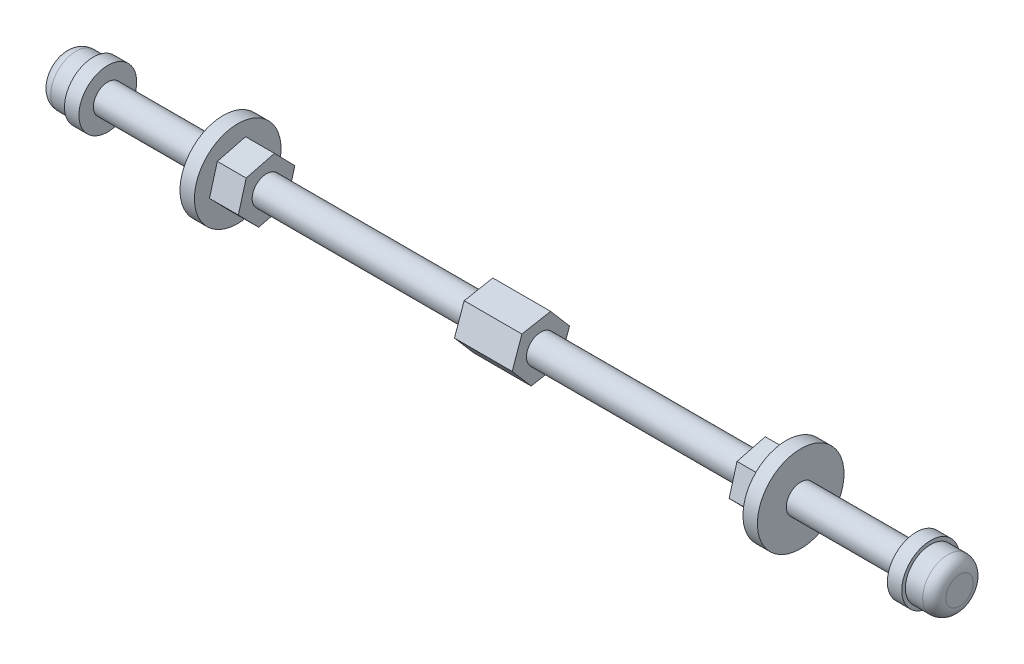
ISO-10303-21;
HEADER;
FILE_DESCRIPTION(('STEP AP214'),'2;1');
FILE_NAME('part.step','',(''),(''),'','','');
FILE_SCHEMA(('AUTOMOTIVE_DESIGN { 1 0 10303 214 1 1 1 1 }'));
ENDSEC;
DATA;
#1=APPLICATION_CONTEXT('core data for automotive mechanical design processes');
#2=APPLICATION_PROTOCOL_DEFINITION('international standard','automotive_design',2000,#1);
#3=PRODUCT_CONTEXT('',#1,'mechanical');
#4=PRODUCT('Part','Part','',(#3));
#5=PRODUCT_RELATED_PRODUCT_CATEGORY('part','',(#4));
#6=PRODUCT_DEFINITION_FORMATION('','',#4);
#7=PRODUCT_DEFINITION_CONTEXT('part definition',#1,'design');
#8=PRODUCT_DEFINITION('design','',#6,#7);
#9=PRODUCT_DEFINITION_SHAPE('','',#8);
#10=(LENGTH_UNIT() NAMED_UNIT(*) SI_UNIT(.MILLI.,.METRE.));
#11=(NAMED_UNIT(*) PLANE_ANGLE_UNIT() SI_UNIT($,.RADIAN.));
#12=(NAMED_UNIT(*) SI_UNIT($,.STERADIAN.) SOLID_ANGLE_UNIT());
#13=UNCERTAINTY_MEASURE_WITH_UNIT(LENGTH_MEASURE(1.E-05),#10,'distance_accuracy_value','');
#14=(GEOMETRIC_REPRESENTATION_CONTEXT(3) GLOBAL_UNCERTAINTY_ASSIGNED_CONTEXT((#13)) GLOBAL_UNIT_ASSIGNED_CONTEXT((#10,
#11,#12)) REPRESENTATION_CONTEXT('',''));
#15=CARTESIAN_POINT('',(0.,0.,0.));
#16=DIRECTION('',(0.,0.,1.));
#17=DIRECTION('',(1.,0.,0.));
#18=AXIS2_PLACEMENT_3D('',#15,#16,#17);
#19=CARTESIAN_POINT('',(-60.325,0.,0.));
#20=DIRECTION('',(1.,0.,0.));
#21=DIRECTION('',(0.,0.,-1.));
#22=AXIS2_PLACEMENT_3D('',#19,#20,#21);
#23=CYLINDRICAL_SURFACE('',#22,3.175);
#24=CARTESIAN_POINT('',(-6.35,0.,0.));
#25=DIRECTION('',(1.,0.,0.));
#26=DIRECTION('',(0.,0.,-1.));
#27=AXIS2_PLACEMENT_3D('',#24,#25,#26);
#28=CIRCLE('',#27,3.175);
#29=CARTESIAN_POINT('',(-6.35,0.,-3.175));
#30=VERTEX_POINT('',#29);
#31=EDGE_CURVE('E329',#30,#30,#28,.T.);
#32=ORIENTED_EDGE('',*,*,#31,.F.);
#33=EDGE_LOOP('',(#32));
#34=FACE_BOUND('',#33,.T.);
#35=CARTESIAN_POINT('',(-53.975,0.,0.));
#36=DIRECTION('',(-1.,0.,0.));
#37=DIRECTION('',(0.,0.,1.));
#38=AXIS2_PLACEMENT_3D('',#35,#36,#37);
#39=CIRCLE('',#38,3.175);
#40=CARTESIAN_POINT('',(-53.975,0.,3.175));
#41=VERTEX_POINT('',#40);
#42=EDGE_CURVE('E249',#41,#41,#39,.F.);
#43=ORIENTED_EDGE('',*,*,#42,.T.);
#44=EDGE_LOOP('',(#43));
#45=FACE_BOUND('',#44,.T.);
#46=ADVANCED_FACE('F41',(#34,#45),#23,.T.);
#47=CARTESIAN_POINT('',(-6.35,-6.0497679994844,2.13608502540229));
#48=DIRECTION('',(0.,-0.983087144735073,-0.183138378983327));
#49=DIRECTION('',(0.,0.183138378983327,-0.983087144735074));
#50=AXIS2_PLACEMENT_3D('',#47,#48,#49);
#51=PLANE('',#50);
#52=DIRECTION('',(1.,0.,0.));
#53=VECTOR('',#52,1.);
#54=CARTESIAN_POINT('',(-6.35,-4.87478789638411,-4.17121026185451));
#55=LINE('',#54,#53);
#56=CARTESIAN_POINT('',(-6.35,-4.87478789638411,-4.17121026185451));
#57=VERTEX_POINT('',#56);
#58=CARTESIAN_POINT('',(6.35,-4.87478789638411,-4.17121026185451));
#59=VERTEX_POINT('',#58);
#60=EDGE_CURVE('E378',#57,#59,#55,.T.);
#61=ORIENTED_EDGE('',*,*,#60,.T.);
#62=DIRECTION('',(0.,0.183138378983327,-0.983087144735073));
#63=VECTOR('',#62,1.);
#64=CARTESIAN_POINT('',(6.35,-6.0497679994844,2.13608502540229));
#65=LINE('',#64,#63);
#66=CARTESIAN_POINT('',(6.35,-6.0497679994844,2.13608502540229));
#67=VERTEX_POINT('',#66);
#68=EDGE_CURVE('E333',#67,#59,#65,.T.);
#69=ORIENTED_EDGE('',*,*,#68,.F.);
#70=DIRECTION('',(1.,0.,0.));
#71=VECTOR('',#70,1.);
#72=CARTESIAN_POINT('',(-6.35,-6.0497679994844,2.13608502540229));
#73=LINE('',#72,#71);
#74=CARTESIAN_POINT('',(-6.35,-6.0497679994844,2.13608502540229));
#75=VERTEX_POINT('',#74);
#76=EDGE_CURVE('E57',#75,#67,#73,.T.);
#77=ORIENTED_EDGE('',*,*,#76,.F.);
#78=DIRECTION('',(0.,0.183138378983327,-0.983087144735073));
#79=VECTOR('',#78,1.);
#80=CARTESIAN_POINT('',(-6.35,-6.0497679994844,2.13608502540229));
#81=LINE('',#80,#79);
#82=EDGE_CURVE('E357',#75,#57,#81,.T.);
#83=ORIENTED_EDGE('',*,*,#82,.T.);
#84=EDGE_LOOP('',(#61,#69,#77,#83));
#85=FACE_BOUND('',#84,.T.);
#86=ADVANCED_FACE('F427',(#85),#51,.T.);
#87=CARTESIAN_POINT('',(-6.35,-1.17498010310029,6.30729528725679));
#88=DIRECTION('',(0.,-0.650146060975,0.759809251982819));
#89=DIRECTION('',(0.,-0.759809251982819,-0.650146060975));
#90=AXIS2_PLACEMENT_3D('',#87,#88,#89);
#91=PLANE('',#90);
#92=ORIENTED_EDGE('',*,*,#76,.T.);
#93=DIRECTION('',(0.,-0.759809251982819,-0.650146060975));
#94=VECTOR('',#93,1.);
#95=CARTESIAN_POINT('',(6.35,-1.17498010310029,6.30729528725679));
#96=LINE('',#95,#94);
#97=CARTESIAN_POINT('',(6.35,-1.17498010310029,6.30729528725679));
#98=VERTEX_POINT('',#97);
#99=EDGE_CURVE('E353',#98,#67,#96,.T.);
#100=ORIENTED_EDGE('',*,*,#99,.F.);
#101=DIRECTION('',(1.,0.,0.));
#102=VECTOR('',#101,1.);
#103=CARTESIAN_POINT('',(-6.35,-1.17498010310029,6.30729528725679));
#104=LINE('',#103,#102);
#105=CARTESIAN_POINT('',(-6.35,-1.17498010310029,6.30729528725679));
#106=VERTEX_POINT('',#105);
#107=EDGE_CURVE('E65',#106,#98,#104,.T.);
#108=ORIENTED_EDGE('',*,*,#107,.F.);
#109=DIRECTION('',(0.,-0.759809251982819,-0.650146060975));
#110=VECTOR('',#109,1.);
#111=CARTESIAN_POINT('',(-6.35,-1.17498010310029,6.30729528725679));
#112=LINE('',#111,#110);
#113=EDGE_CURVE('E375',#106,#75,#112,.T.);
#114=ORIENTED_EDGE('',*,*,#113,.T.);
#115=EDGE_LOOP('',(#92,#100,#108,#114));
#116=FACE_BOUND('',#115,.T.);
#117=ADVANCED_FACE('F434',(#116),#91,.T.);
#118=CARTESIAN_POINT('',(-6.35,4.87478789638411,4.17121026185451));
#119=DIRECTION('',(0.,0.332941083760074,0.942947630966146));
#120=DIRECTION('',(0.,-0.942947630966146,0.332941083760074));
#121=AXIS2_PLACEMENT_3D('',#118,#119,#120);
#122=PLANE('',#121);
#123=ORIENTED_EDGE('',*,*,#107,.T.);
#124=DIRECTION('',(0.,-0.942947630966146,0.332941083760074));
#125=VECTOR('',#124,1.);
#126=CARTESIAN_POINT('',(6.35,4.87478789638411,4.17121026185451));
#127=LINE('',#126,#125);
#128=CARTESIAN_POINT('',(6.35,4.87478789638411,4.17121026185451));
#129=VERTEX_POINT('',#128);
#130=EDGE_CURVE('E349',#129,#98,#127,.T.);
#131=ORIENTED_EDGE('',*,*,#130,.F.);
#132=DIRECTION('',(1.,0.,0.));
#133=VECTOR('',#132,1.);
#134=CARTESIAN_POINT('',(-6.35,4.87478789638411,4.17121026185451));
#135=LINE('',#134,#133);
#136=CARTESIAN_POINT('',(-6.35,4.87478789638411,4.17121026185451));
#137=VERTEX_POINT('',#136);
#138=EDGE_CURVE('E384',#137,#129,#135,.T.);
#139=ORIENTED_EDGE('',*,*,#138,.F.);
#140=DIRECTION('',(0.,-0.942947630966146,0.332941083760074));
#141=VECTOR('',#140,1.);
#142=CARTESIAN_POINT('',(-6.35,4.87478789638411,4.17121026185451));
#143=LINE('',#142,#141);
#144=EDGE_CURVE('E372',#137,#106,#143,.T.);
#145=ORIENTED_EDGE('',*,*,#144,.T.);
#146=EDGE_LOOP('',(#123,#131,#139,#145));
#147=FACE_BOUND('',#146,.T.);
#148=ADVANCED_FACE('F805',(#147),#122,.T.);
#149=CARTESIAN_POINT('',(-6.35,6.0497679994844,-2.13608502540229));
#150=DIRECTION('',(0.,0.983087144735074,0.183138378983327));
#151=DIRECTION('',(0.,-0.183138378983327,0.983087144735074));
#152=AXIS2_PLACEMENT_3D('',#149,#150,#151);
#153=PLANE('',#152);
#154=ORIENTED_EDGE('',*,*,#138,.T.);
#155=DIRECTION('',(0.,-0.183138378983327,0.983087144735074));
#156=VECTOR('',#155,1.);
#157=CARTESIAN_POINT('',(6.35,6.0497679994844,-2.13608502540229));
#158=LINE('',#157,#156);
#159=CARTESIAN_POINT('',(6.35,6.0497679994844,-2.13608502540229));
#160=VERTEX_POINT('',#159);
#161=EDGE_CURVE('E345',#160,#129,#158,.T.);
#162=ORIENTED_EDGE('',*,*,#161,.F.);
#163=DIRECTION('',(1.,0.,0.));
#164=VECTOR('',#163,1.);
#165=CARTESIAN_POINT('',(-6.35,6.0497679994844,-2.13608502540229));
#166=LINE('',#165,#164);
#167=CARTESIAN_POINT('',(-6.35,6.0497679994844,-2.13608502540229));
#168=VERTEX_POINT('',#167);
#169=EDGE_CURVE('E387',#168,#160,#166,.T.);
#170=ORIENTED_EDGE('',*,*,#169,.F.);
#171=DIRECTION('',(0.,-0.183138378983327,0.983087144735074));
#172=VECTOR('',#171,1.);
#173=CARTESIAN_POINT('',(-6.35,6.0497679994844,-2.13608502540229));
#174=LINE('',#173,#172);
#175=EDGE_CURVE('E368',#168,#137,#174,.T.);
#176=ORIENTED_EDGE('',*,*,#175,.T.);
#177=EDGE_LOOP('',(#154,#162,#170,#176));
#178=FACE_BOUND('',#177,.T.);
#179=ADVANCED_FACE('F796',(#178),#153,.T.);
#180=CARTESIAN_POINT('',(-6.35,1.17498010310029,-6.30729528725679));
#181=DIRECTION('',(0.,0.650146060975,-0.759809251982819));
#182=DIRECTION('',(0.,0.759809251982819,0.650146060975));
#183=AXIS2_PLACEMENT_3D('',#180,#181,#182);
#184=PLANE('',#183);
#185=ORIENTED_EDGE('',*,*,#169,.T.);
#186=DIRECTION('',(0.,0.759809251982819,0.650146060975));
#187=VECTOR('',#186,1.);
#188=CARTESIAN_POINT('',(6.35,1.17498010310029,-6.30729528725679));
#189=LINE('',#188,#187);
#190=CARTESIAN_POINT('',(6.35,1.17498010310029,-6.30729528725679));
#191=VERTEX_POINT('',#190);
#192=EDGE_CURVE('E341',#191,#160,#189,.T.);
#193=ORIENTED_EDGE('',*,*,#192,.F.);
#194=DIRECTION('',(1.,0.,0.));
#195=VECTOR('',#194,1.);
#196=CARTESIAN_POINT('',(-6.35,1.17498010310029,-6.30729528725679));
#197=LINE('',#196,#195);
#198=CARTESIAN_POINT('',(-6.35,1.17498010310029,-6.30729528725679));
#199=VERTEX_POINT('',#198);
#200=EDGE_CURVE('E390',#199,#191,#197,.T.);
#201=ORIENTED_EDGE('',*,*,#200,.F.);
#202=DIRECTION('',(0.,0.759809251982819,0.650146060975));
#203=VECTOR('',#202,1.);
#204=CARTESIAN_POINT('',(-6.35,1.17498010310029,-6.30729528725679));
#205=LINE('',#204,#203);
#206=EDGE_CURVE('E364',#199,#168,#205,.T.);
#207=ORIENTED_EDGE('',*,*,#206,.T.);
#208=EDGE_LOOP('',(#185,#193,#201,#207));
#209=FACE_BOUND('',#208,.T.);
#210=ADVANCED_FACE('F787',(#209),#184,.T.);
#211=CARTESIAN_POINT('',(-6.35,-4.87478789638411,-4.17121026185451));
#212=DIRECTION('',(0.,-0.332941083760073,-0.942947630966146));
#213=DIRECTION('',(0.,0.942947630966146,-0.332941083760074));
#214=AXIS2_PLACEMENT_3D('',#211,#212,#213);
#215=PLANE('',#214);
#216=ORIENTED_EDGE('',*,*,#200,.T.);
#217=DIRECTION('',(0.,0.942947630966146,-0.332941083760073));
#218=VECTOR('',#217,1.);
#219=CARTESIAN_POINT('',(6.35,-4.87478789638411,-4.17121026185451));
#220=LINE('',#219,#218);
#221=EDGE_CURVE('E337',#59,#191,#220,.T.);
#222=ORIENTED_EDGE('',*,*,#221,.F.);
#223=ORIENTED_EDGE('',*,*,#60,.F.);
#224=DIRECTION('',(0.,0.942947630966146,-0.332941083760073));
#225=VECTOR('',#224,1.);
#226=CARTESIAN_POINT('',(-6.35,-4.87478789638411,-4.17121026185451));
#227=LINE('',#226,#225);
#228=EDGE_CURVE('E360',#57,#199,#227,.T.);
#229=ORIENTED_EDGE('',*,*,#228,.T.);
#230=EDGE_LOOP('',(#216,#222,#223,#229));
#231=FACE_BOUND('',#230,.T.);
#232=ADVANCED_FACE('F778',(#231),#215,.T.);
#233=CARTESIAN_POINT('',(-6.35,0.,0.));
#234=DIRECTION('',(1.,0.,0.));
#235=DIRECTION('',(0.,0.,-1.));
#236=AXIS2_PLACEMENT_3D('',#233,#234,#235);
#237=PLANE('',#236);
#238=ORIENTED_EDGE('',*,*,#31,.T.);
#239=EDGE_LOOP('',(#238));
#240=FACE_BOUND('',#239,.T.);
#241=ORIENTED_EDGE('',*,*,#82,.F.);
#242=ORIENTED_EDGE('',*,*,#113,.F.);
#243=ORIENTED_EDGE('',*,*,#144,.F.);
#244=ORIENTED_EDGE('',*,*,#175,.F.);
#245=ORIENTED_EDGE('',*,*,#206,.F.);
#246=ORIENTED_EDGE('',*,*,#228,.F.);
#247=EDGE_LOOP('',(#241,#242,#243,#244,#245,#246));
#248=FACE_BOUND('',#247,.T.);
#249=ADVANCED_FACE('F450',(#240,#248),#237,.F.);
#250=CARTESIAN_POINT('',(6.35,0.,0.));
#251=DIRECTION('',(1.,0.,0.));
#252=DIRECTION('',(0.,0.,-1.));
#253=AXIS2_PLACEMENT_3D('',#250,#251,#252);
#254=PLANE('',#253);
#255=CARTESIAN_POINT('',(6.35,0.,0.));
#256=DIRECTION('',(1.,0.,0.));
#257=DIRECTION('',(0.,0.,-1.));
#258=AXIS2_PLACEMENT_3D('',#255,#256,#257);
#259=CIRCLE('',#258,3.175);
#260=CARTESIAN_POINT('',(6.35,0.,-3.175));
#261=VERTEX_POINT('',#260);
#262=EDGE_CURVE('E381',#261,#261,#259,.T.);
#263=ORIENTED_EDGE('',*,*,#262,.F.);
#264=EDGE_LOOP('',(#263));
#265=FACE_BOUND('',#264,.T.);
#266=ORIENTED_EDGE('',*,*,#68,.T.);
#267=ORIENTED_EDGE('',*,*,#221,.T.);
#268=ORIENTED_EDGE('',*,*,#192,.T.);
#269=ORIENTED_EDGE('',*,*,#161,.T.);
#270=ORIENTED_EDGE('',*,*,#130,.T.);
#271=ORIENTED_EDGE('',*,*,#99,.T.);
#272=EDGE_LOOP('',(#266,#267,#268,#269,#270,#271));
#273=FACE_BOUND('',#272,.T.);
#274=ADVANCED_FACE('F442',(#265,#273),#254,.T.);
#275=ORIENTED_EDGE('',*,*,#262,.T.);
#276=EDGE_LOOP('',(#275));
#277=FACE_BOUND('',#276,.T.);
#278=CARTESIAN_POINT('',(53.975,0.,0.));
#279=DIRECTION('',(1.,0.,0.));
#280=DIRECTION('',(0.,0.,-1.));
#281=AXIS2_PLACEMENT_3D('',#278,#279,#280);
#282=CIRCLE('',#281,3.175);
#283=CARTESIAN_POINT('',(53.975,0.,-3.175));
#284=VERTEX_POINT('',#283);
#285=EDGE_CURVE('E325',#284,#284,#282,.T.);
#286=ORIENTED_EDGE('',*,*,#285,.F.);
#287=EDGE_LOOP('',(#286));
#288=FACE_BOUND('',#287,.T.);
#289=ADVANCED_FACE('F430',(#277,#288),#23,.T.);
#290=CARTESIAN_POINT('',(60.325,-6.17917672834168,1.72636237309958));
#291=DIRECTION('',(0.,0.968624410686555,0.248529175394207));
#292=DIRECTION('',(0.,-0.248529175394207,0.968624410686555));
#293=AXIS2_PLACEMENT_3D('',#290,#291,#292);
#294=PLANE('',#293);
#295=DIRECTION('',(0.,0.248529175394207,-0.968624410686555));
#296=VECTOR('',#295,1.);
#297=CARTESIAN_POINT('',(53.975,-6.17917672834168,1.72636237309958));
#298=LINE('',#297,#296);
#299=CARTESIAN_POINT('',(53.975,-6.17917672834168,1.72636237309958));
#300=VERTEX_POINT('',#299);
#301=CARTESIAN_POINT('',(53.975,-4.58466203541267,-4.48814283466771));
#302=VERTEX_POINT('',#301);
#303=EDGE_CURVE('E254',#300,#302,#298,.T.);
#304=ORIENTED_EDGE('',*,*,#303,.T.);
#305=DIRECTION('',(-1.,0.,0.));
#306=VECTOR('',#305,1.);
#307=CARTESIAN_POINT('',(60.325,-4.58466203541267,-4.48814283466771));
#308=LINE('',#307,#306);
#309=CARTESIAN_POINT('',(60.325,-4.58466203541267,-4.48814283466771));
#310=VERTEX_POINT('',#309);
#311=EDGE_CURVE('E321',#310,#302,#308,.T.);
#312=ORIENTED_EDGE('',*,*,#311,.F.);
#313=DIRECTION('',(0.,0.248529175394207,-0.968624410686555));
#314=VECTOR('',#313,1.);
#315=CARTESIAN_POINT('',(60.325,-6.17917672834168,1.72636237309958));
#316=LINE('',#315,#314);
#317=CARTESIAN_POINT('',(60.325,-6.17917672834168,1.72636237309958));
#318=VERTEX_POINT('',#317);
#319=EDGE_CURVE('E259',#318,#310,#316,.T.);
#320=ORIENTED_EDGE('',*,*,#319,.F.);
#321=DIRECTION('',(-1.,0.,0.));
#322=VECTOR('',#321,1.);
#323=CARTESIAN_POINT('',(60.325,-6.17917672834168,1.72636237309958));
#324=LINE('',#323,#322);
#325=EDGE_CURVE('E284',#318,#300,#324,.T.);
#326=ORIENTED_EDGE('',*,*,#325,.T.);
#327=EDGE_LOOP('',(#304,#312,#320,#326));
#328=FACE_BOUND('',#327,.T.);
#329=ADVANCED_FACE('F441',(#328),#294,.F.);
#330=CARTESIAN_POINT('',(60.325,-4.58466203541267,-4.48814283466771));
#331=DIRECTION('',(0.,0.269079625870295,0.963117934077391));
#332=DIRECTION('',(0.,-0.963117934077391,0.269079625870295));
#333=AXIS2_PLACEMENT_3D('',#330,#331,#332);
#334=PLANE('',#333);
#335=DIRECTION('',(0.,0.963117934077391,-0.269079625870295));
#336=VECTOR('',#335,1.);
#337=CARTESIAN_POINT('',(53.975,-4.58466203541267,-4.48814283466771));
#338=LINE('',#337,#336);
#339=CARTESIAN_POINT('',(53.975,1.59451469292901,-6.21450520776729));
#340=VERTEX_POINT('',#339);
#341=EDGE_CURVE('E288',#302,#340,#338,.T.);
#342=ORIENTED_EDGE('',*,*,#341,.T.);
#343=DIRECTION('',(-1.,0.,0.));
#344=VECTOR('',#343,1.);
#345=CARTESIAN_POINT('',(60.325,1.59451469292901,-6.21450520776729));
#346=LINE('',#345,#344);
#347=CARTESIAN_POINT('',(60.325,1.59451469292901,-6.21450520776729));
#348=VERTEX_POINT('',#347);
#349=EDGE_CURVE('E317',#348,#340,#346,.T.);
#350=ORIENTED_EDGE('',*,*,#349,.F.);
#351=DIRECTION('',(0.,0.963117934077391,-0.269079625870295));
#352=VECTOR('',#351,1.);
#353=CARTESIAN_POINT('',(60.325,-4.58466203541267,-4.48814283466771));
#354=LINE('',#353,#352);
#355=EDGE_CURVE('E263',#310,#348,#354,.T.);
#356=ORIENTED_EDGE('',*,*,#355,.F.);
#357=ORIENTED_EDGE('',*,*,#311,.T.);
#358=EDGE_LOOP('',(#342,#350,#356,#357));
#359=FACE_BOUND('',#358,.T.);
#360=ADVANCED_FACE('F448',(#359),#334,.F.);
#361=CARTESIAN_POINT('',(60.325,1.59451469292901,-6.21450520776729));
#362=DIRECTION('',(0.,-0.699544784816259,0.714588758683184));
#363=DIRECTION('',(0.,-0.714588758683184,-0.699544784816259));
#364=AXIS2_PLACEMENT_3D('',#361,#362,#363);
#365=PLANE('',#364);
#366=DIRECTION('',(0.,0.714588758683184,0.699544784816259));
#367=VECTOR('',#366,1.);
#368=CARTESIAN_POINT('',(53.975,1.59451469292901,-6.21450520776729));
#369=LINE('',#368,#367);
#370=CARTESIAN_POINT('',(53.975,6.17917672834167,-1.72636237309958));
#371=VERTEX_POINT('',#370);
#372=EDGE_CURVE('E291',#340,#371,#369,.T.);
#373=ORIENTED_EDGE('',*,*,#372,.T.);
#374=DIRECTION('',(-1.,0.,0.));
#375=VECTOR('',#374,1.);
#376=CARTESIAN_POINT('',(60.325,6.17917672834167,-1.72636237309958));
#377=LINE('',#376,#375);
#378=CARTESIAN_POINT('',(60.325,6.17917672834167,-1.72636237309958));
#379=VERTEX_POINT('',#378);
#380=EDGE_CURVE('E313',#379,#371,#377,.T.);
#381=ORIENTED_EDGE('',*,*,#380,.F.);
#382=DIRECTION('',(0.,0.714588758683184,0.699544784816259));
#383=VECTOR('',#382,1.);
#384=CARTESIAN_POINT('',(60.325,1.59451469292901,-6.21450520776729));
#385=LINE('',#384,#383);
#386=EDGE_CURVE('E268',#348,#379,#385,.T.);
#387=ORIENTED_EDGE('',*,*,#386,.F.);
#388=ORIENTED_EDGE('',*,*,#349,.T.);
#389=EDGE_LOOP('',(#373,#381,#387,#388));
#390=FACE_BOUND('',#389,.T.);
#391=ADVANCED_FACE('F480',(#390),#365,.F.);
#392=CARTESIAN_POINT('',(60.325,6.17917672834167,-1.72636237309958));
#393=DIRECTION('',(0.,-0.968624410686555,-0.248529175394207));
#394=DIRECTION('',(0.,0.248529175394207,-0.968624410686555));
#395=AXIS2_PLACEMENT_3D('',#392,#393,#394);
#396=PLANE('',#395);
#397=DIRECTION('',(0.,-0.248529175394207,0.968624410686555));
#398=VECTOR('',#397,1.);
#399=CARTESIAN_POINT('',(53.975,6.17917672834167,-1.72636237309958));
#400=LINE('',#399,#398);
#401=CARTESIAN_POINT('',(53.975,4.58466203541267,4.48814283466771));
#402=VERTEX_POINT('',#401);
#403=EDGE_CURVE('E294',#371,#402,#400,.T.);
#404=ORIENTED_EDGE('',*,*,#403,.T.);
#405=DIRECTION('',(-1.,0.,0.));
#406=VECTOR('',#405,1.);
#407=CARTESIAN_POINT('',(60.325,4.58466203541267,4.48814283466771));
#408=LINE('',#407,#406);
#409=CARTESIAN_POINT('',(60.325,4.58466203541267,4.48814283466771));
#410=VERTEX_POINT('',#409);
#411=EDGE_CURVE('E309',#410,#402,#408,.T.);
#412=ORIENTED_EDGE('',*,*,#411,.F.);
#413=DIRECTION('',(0.,-0.248529175394207,0.968624410686555));
#414=VECTOR('',#413,1.);
#415=CARTESIAN_POINT('',(60.325,6.17917672834167,-1.72636237309958));
#416=LINE('',#415,#414);
#417=EDGE_CURVE('E272',#379,#410,#416,.T.);
#418=ORIENTED_EDGE('',*,*,#417,.F.);
#419=ORIENTED_EDGE('',*,*,#380,.T.);
#420=EDGE_LOOP('',(#404,#412,#418,#419));
#421=FACE_BOUND('',#420,.T.);
#422=ADVANCED_FACE('F477',(#421),#396,.F.);
#423=CARTESIAN_POINT('',(60.325,4.58466203541267,4.48814283466771));
#424=DIRECTION('',(0.,-0.269079625870295,-0.963117934077391));
#425=DIRECTION('',(0.,0.963117934077391,-0.269079625870295));
#426=AXIS2_PLACEMENT_3D('',#423,#424,#425);
#427=PLANE('',#426);
#428=DIRECTION('',(0.,-0.963117934077391,0.269079625870295));
#429=VECTOR('',#428,1.);
#430=CARTESIAN_POINT('',(53.975,4.58466203541267,4.48814283466771));
#431=LINE('',#430,#429);
#432=CARTESIAN_POINT('',(53.975,-1.59451469292901,6.21450520776729));
#433=VERTEX_POINT('',#432);
#434=EDGE_CURVE('E297',#402,#433,#431,.T.);
#435=ORIENTED_EDGE('',*,*,#434,.T.);
#436=DIRECTION('',(-1.,0.,0.));
#437=VECTOR('',#436,1.);
#438=CARTESIAN_POINT('',(60.325,-1.59451469292901,6.21450520776729));
#439=LINE('',#438,#437);
#440=CARTESIAN_POINT('',(60.325,-1.59451469292901,6.21450520776729));
#441=VERTEX_POINT('',#440);
#442=EDGE_CURVE('E305',#441,#433,#439,.T.);
#443=ORIENTED_EDGE('',*,*,#442,.F.);
#444=DIRECTION('',(0.,-0.963117934077391,0.269079625870295));
#445=VECTOR('',#444,1.);
#446=CARTESIAN_POINT('',(60.325,4.58466203541267,4.48814283466771));
#447=LINE('',#446,#445);
#448=EDGE_CURVE('E276',#410,#441,#447,.T.);
#449=ORIENTED_EDGE('',*,*,#448,.F.);
#450=ORIENTED_EDGE('',*,*,#411,.T.);
#451=EDGE_LOOP('',(#435,#443,#449,#450));
#452=FACE_BOUND('',#451,.T.);
#453=ADVANCED_FACE('F474',(#452),#427,.F.);
#454=CARTESIAN_POINT('',(60.325,-1.59451469292901,6.21450520776729));
#455=DIRECTION('',(0.,0.699544784816259,-0.714588758683184));
#456=DIRECTION('',(0.,0.714588758683184,0.699544784816259));
#457=AXIS2_PLACEMENT_3D('',#454,#455,#456);
#458=PLANE('',#457);
#459=DIRECTION('',(0.,-0.714588758683184,-0.699544784816259));
#460=VECTOR('',#459,1.);
#461=CARTESIAN_POINT('',(53.975,-1.59451469292901,6.21450520776729));
#462=LINE('',#461,#460);
#463=EDGE_CURVE('E264',#433,#300,#462,.T.);
#464=ORIENTED_EDGE('',*,*,#463,.T.);
#465=ORIENTED_EDGE('',*,*,#325,.F.);
#466=DIRECTION('',(0.,-0.714588758683184,-0.699544784816259));
#467=VECTOR('',#466,1.);
#468=CARTESIAN_POINT('',(60.325,-1.59451469292901,6.21450520776729));
#469=LINE('',#468,#467);
#470=EDGE_CURVE('E280',#441,#318,#469,.T.);
#471=ORIENTED_EDGE('',*,*,#470,.F.);
#472=ORIENTED_EDGE('',*,*,#442,.T.);
#473=EDGE_LOOP('',(#464,#465,#471,#472));
#474=FACE_BOUND('',#473,.T.);
#475=ADVANCED_FACE('F460',(#474),#458,.F.);
#476=CARTESIAN_POINT('',(53.975,0.,0.));
#477=DIRECTION('',(1.,0.,0.));
#478=DIRECTION('',(0.,0.,-1.));
#479=AXIS2_PLACEMENT_3D('',#476,#477,#478);
#480=PLANE('',#479);
#481=ORIENTED_EDGE('',*,*,#285,.T.);
#482=EDGE_LOOP('',(#481));
#483=FACE_BOUND('',#482,.T.);
#484=ORIENTED_EDGE('',*,*,#303,.F.);
#485=ORIENTED_EDGE('',*,*,#463,.F.);
#486=ORIENTED_EDGE('',*,*,#434,.F.);
#487=ORIENTED_EDGE('',*,*,#403,.F.);
#488=ORIENTED_EDGE('',*,*,#372,.F.);
#489=ORIENTED_EDGE('',*,*,#341,.F.);
#490=EDGE_LOOP('',(#484,#485,#486,#487,#488,#489));
#491=FACE_BOUND('',#490,.T.);
#492=ADVANCED_FACE('F456',(#483,#491),#480,.F.);
#493=CARTESIAN_POINT('',(60.325,0.,0.));
#494=DIRECTION('',(1.,0.,0.));
#495=DIRECTION('',(0.,0.,-1.));
#496=AXIS2_PLACEMENT_3D('',#493,#494,#495);
#497=PLANE('',#496);
#498=CARTESIAN_POINT('',(60.325,0.,0.));
#499=DIRECTION('',(1.,0.,0.));
#500=DIRECTION('',(0.,0.,-1.));
#501=AXIS2_PLACEMENT_3D('',#498,#499,#500);
#502=CIRCLE('',#501,9.525);
#503=CARTESIAN_POINT('',(60.325,0.,-9.525));
#504=VERTEX_POINT('',#503);
#505=EDGE_CURVE('E255',#504,#504,#502,.T.);
#506=ORIENTED_EDGE('',*,*,#505,.F.);
#507=EDGE_LOOP('',(#506));
#508=FACE_BOUND('',#507,.T.);
#509=ORIENTED_EDGE('',*,*,#470,.T.);
#510=ORIENTED_EDGE('',*,*,#319,.T.);
#511=ORIENTED_EDGE('',*,*,#355,.T.);
#512=ORIENTED_EDGE('',*,*,#386,.T.);
#513=ORIENTED_EDGE('',*,*,#417,.T.);
#514=ORIENTED_EDGE('',*,*,#448,.T.);
#515=EDGE_LOOP('',(#509,#510,#511,#512,#513,#514));
#516=FACE_BOUND('',#515,.T.);
#517=ADVANCED_FACE('F459',(#508,#516),#497,.F.);
#518=CARTESIAN_POINT('',(63.5,0.,0.));
#519=DIRECTION('',(-1.,0.,0.));
#520=DIRECTION('',(0.,0.,1.));
#521=AXIS2_PLACEMENT_3D('',#518,#519,#520);
#522=CYLINDRICAL_SURFACE('',#521,9.525);
#523=CARTESIAN_POINT('',(63.5,0.,0.));
#524=DIRECTION('',(1.,0.,0.));
#525=DIRECTION('',(0.,0.,-1.));
#526=AXIS2_PLACEMENT_3D('',#523,#524,#525);
#527=CIRCLE('',#526,9.525);
#528=CARTESIAN_POINT('',(63.5,0.,-9.525));
#529=VERTEX_POINT('',#528);
#530=EDGE_CURVE('E250',#529,#529,#527,.T.);
#531=ORIENTED_EDGE('',*,*,#530,.F.);
#532=EDGE_LOOP('',(#531));
#533=FACE_BOUND('',#532,.T.);
#534=ORIENTED_EDGE('',*,*,#505,.T.);
#535=EDGE_LOOP('',(#534));
#536=FACE_BOUND('',#535,.T.);
#537=ADVANCED_FACE('F495',(#533,#536),#522,.T.);
#538=CARTESIAN_POINT('',(63.5,0.,0.));
#539=DIRECTION('',(1.,0.,0.));
#540=DIRECTION('',(0.,0.,-1.));
#541=AXIS2_PLACEMENT_3D('',#538,#539,#540);
#542=PLANE('',#541);
#543=CARTESIAN_POINT('',(63.5,0.,0.));
#544=DIRECTION('',(1.,0.,0.));
#545=DIRECTION('',(0.,0.,-1.));
#546=AXIS2_PLACEMENT_3D('',#543,#544,#545);
#547=CIRCLE('',#546,3.175);
#548=CARTESIAN_POINT('',(63.5,0.,-3.175));
#549=VERTEX_POINT('',#548);
#550=EDGE_CURVE('E398',#549,#549,#547,.T.);
#551=ORIENTED_EDGE('',*,*,#550,.F.);
#552=EDGE_LOOP('',(#551));
#553=FACE_BOUND('',#552,.T.);
#554=ORIENTED_EDGE('',*,*,#530,.T.);
#555=EDGE_LOOP('',(#554));
#556=FACE_BOUND('',#555,.T.);
#557=ADVANCED_FACE('F498',(#553,#556),#542,.T.);
#558=CARTESIAN_POINT('',(-60.325,-6.17917672834168,1.72636237309958));
#559=DIRECTION('',(0.,-0.968624410686555,-0.248529175394207));
#560=DIRECTION('',(0.,0.248529175394207,-0.968624410686555));
#561=AXIS2_PLACEMENT_3D('',#558,#559,#560);
#562=PLANE('',#561);
#563=DIRECTION('',(0.,0.248529175394207,-0.968624410686555));
#564=VECTOR('',#563,1.);
#565=CARTESIAN_POINT('',(-53.975,-6.17917672834168,1.72636237309958));
#566=LINE('',#565,#564);
#567=CARTESIAN_POINT('',(-53.975,-6.17917672834168,1.72636237309958));
#568=VERTEX_POINT('',#567);
#569=CARTESIAN_POINT('',(-53.975,-4.58466203541267,-4.48814283466771));
#570=VERTEX_POINT('',#569);
#571=EDGE_CURVE('E217',#568,#570,#566,.T.);
#572=ORIENTED_EDGE('',*,*,#571,.F.);
#573=DIRECTION('',(1.,0.,0.));
#574=VECTOR('',#573,1.);
#575=CARTESIAN_POINT('',(-60.325,-6.17917672834168,1.72636237309958));
#576=LINE('',#575,#574);
#577=CARTESIAN_POINT('',(-60.325,-6.17917672834168,1.72636237309958));
#578=VERTEX_POINT('',#577);
#579=EDGE_CURVE('E193',#578,#568,#576,.T.);
#580=ORIENTED_EDGE('',*,*,#579,.F.);
#581=DIRECTION('',(0.,0.248529175394207,-0.968624410686555));
#582=VECTOR('',#581,1.);
#583=CARTESIAN_POINT('',(-60.325,-6.17917672834168,1.72636237309958));
#584=LINE('',#583,#582);
#585=CARTESIAN_POINT('',(-60.325,-4.58466203541267,-4.48814283466771));
#586=VERTEX_POINT('',#585);
#587=EDGE_CURVE('E173',#578,#586,#584,.T.);
#588=ORIENTED_EDGE('',*,*,#587,.T.);
#589=DIRECTION('',(1.,0.,0.));
#590=VECTOR('',#589,1.);
#591=CARTESIAN_POINT('',(-60.325,-4.58466203541267,-4.48814283466771));
#592=LINE('',#591,#590);
#593=EDGE_CURVE('E180',#586,#570,#592,.T.);
#594=ORIENTED_EDGE('',*,*,#593,.T.);
#595=EDGE_LOOP('',(#572,#580,#588,#594));
#596=FACE_BOUND('',#595,.T.);
#597=ADVANCED_FACE('F192',(#596),#562,.T.);
#598=CARTESIAN_POINT('',(-60.325,-1.59451469292901,6.21450520776729));
#599=DIRECTION('',(0.,-0.699544784816259,0.714588758683184));
#600=DIRECTION('',(0.,-0.714588758683184,-0.699544784816259));
#601=AXIS2_PLACEMENT_3D('',#598,#599,#600);
#602=PLANE('',#601);
#603=DIRECTION('',(0.,-0.714588758683184,-0.699544784816259));
#604=VECTOR('',#603,1.);
#605=CARTESIAN_POINT('',(-53.975,-1.59451469292901,6.21450520776729));
#606=LINE('',#605,#604);
#607=CARTESIAN_POINT('',(-53.975,-1.59451469292901,6.21450520776729));
#608=VERTEX_POINT('',#607);
#609=EDGE_CURVE('E220',#608,#568,#606,.T.);
#610=ORIENTED_EDGE('',*,*,#609,.F.);
#611=DIRECTION('',(1.,0.,0.));
#612=VECTOR('',#611,1.);
#613=CARTESIAN_POINT('',(-60.325,-1.59451469292901,6.21450520776729));
#614=LINE('',#613,#612);
#615=CARTESIAN_POINT('',(-60.325,-1.59451469292901,6.21450520776729));
#616=VERTEX_POINT('',#615);
#617=EDGE_CURVE('E244',#616,#608,#614,.T.);
#618=ORIENTED_EDGE('',*,*,#617,.F.);
#619=DIRECTION('',(0.,-0.714588758683184,-0.699544784816259));
#620=VECTOR('',#619,1.);
#621=CARTESIAN_POINT('',(-60.325,-1.59451469292901,6.21450520776729));
#622=LINE('',#621,#620);
#623=EDGE_CURVE('E196',#616,#578,#622,.T.);
#624=ORIENTED_EDGE('',*,*,#623,.T.);
#625=ORIENTED_EDGE('',*,*,#579,.T.);
#626=EDGE_LOOP('',(#610,#618,#624,#625));
#627=FACE_BOUND('',#626,.T.);
#628=ADVANCED_FACE('F508',(#627),#602,.T.);
#629=CARTESIAN_POINT('',(-60.325,4.58466203541267,4.48814283466771));
#630=DIRECTION('',(0.,0.269079625870295,0.963117934077391));
#631=DIRECTION('',(0.,-0.963117934077391,0.269079625870295));
#632=AXIS2_PLACEMENT_3D('',#629,#630,#631);
#633=PLANE('',#632);
#634=DIRECTION('',(0.,-0.963117934077391,0.269079625870295));
#635=VECTOR('',#634,1.);
#636=CARTESIAN_POINT('',(-53.975,4.58466203541267,4.48814283466771));
#637=LINE('',#636,#635);
#638=CARTESIAN_POINT('',(-53.975,4.58466203541267,4.48814283466771));
#639=VERTEX_POINT('',#638);
#640=EDGE_CURVE('E225',#639,#608,#637,.T.);
#641=ORIENTED_EDGE('',*,*,#640,.F.);
#642=DIRECTION('',(1.,0.,0.));
#643=VECTOR('',#642,1.);
#644=CARTESIAN_POINT('',(-60.325,4.58466203541267,4.48814283466771));
#645=LINE('',#644,#643);
#646=CARTESIAN_POINT('',(-60.325,4.58466203541267,4.48814283466771));
#647=VERTEX_POINT('',#646);
#648=EDGE_CURVE('E241',#647,#639,#645,.T.);
#649=ORIENTED_EDGE('',*,*,#648,.F.);
#650=DIRECTION('',(0.,-0.963117934077391,0.269079625870295));
#651=VECTOR('',#650,1.);
#652=CARTESIAN_POINT('',(-60.325,4.58466203541267,4.48814283466771));
#653=LINE('',#652,#651);
#654=EDGE_CURVE('E200',#647,#616,#653,.T.);
#655=ORIENTED_EDGE('',*,*,#654,.T.);
#656=ORIENTED_EDGE('',*,*,#617,.T.);
#657=EDGE_LOOP('',(#641,#649,#655,#656));
#658=FACE_BOUND('',#657,.T.);
#659=ADVANCED_FACE('F511',(#658),#633,.T.);
#660=CARTESIAN_POINT('',(-60.325,6.17917672834167,-1.72636237309958));
#661=DIRECTION('',(0.,0.968624410686555,0.248529175394207));
#662=DIRECTION('',(0.,-0.248529175394207,0.968624410686555));
#663=AXIS2_PLACEMENT_3D('',#660,#661,#662);
#664=PLANE('',#663);
#665=DIRECTION('',(0.,-0.248529175394207,0.968624410686555));
#666=VECTOR('',#665,1.);
#667=CARTESIAN_POINT('',(-53.975,6.17917672834167,-1.72636237309958));
#668=LINE('',#667,#666);
#669=CARTESIAN_POINT('',(-53.975,6.17917672834167,-1.72636237309958));
#670=VERTEX_POINT('',#669);
#671=EDGE_CURVE('E229',#670,#639,#668,.T.);
#672=ORIENTED_EDGE('',*,*,#671,.F.);
#673=DIRECTION('',(1.,0.,0.));
#674=VECTOR('',#673,1.);
#675=CARTESIAN_POINT('',(-60.325,6.17917672834167,-1.72636237309958));
#676=LINE('',#675,#674);
#677=CARTESIAN_POINT('',(-60.325,6.17917672834167,-1.72636237309958));
#678=VERTEX_POINT('',#677);
#679=EDGE_CURVE('E238',#678,#670,#676,.T.);
#680=ORIENTED_EDGE('',*,*,#679,.F.);
#681=DIRECTION('',(0.,-0.248529175394207,0.968624410686555));
#682=VECTOR('',#681,1.);
#683=CARTESIAN_POINT('',(-60.325,6.17917672834167,-1.72636237309958));
#684=LINE('',#683,#682);
#685=EDGE_CURVE('E211',#678,#647,#684,.T.);
#686=ORIENTED_EDGE('',*,*,#685,.T.);
#687=ORIENTED_EDGE('',*,*,#648,.T.);
#688=EDGE_LOOP('',(#672,#680,#686,#687));
#689=FACE_BOUND('',#688,.T.);
#690=ADVANCED_FACE('F515',(#689),#664,.T.);
#691=CARTESIAN_POINT('',(-60.325,1.59451469292901,-6.21450520776729));
#692=DIRECTION('',(0.,0.699544784816259,-0.714588758683184));
#693=DIRECTION('',(0.,0.714588758683184,0.699544784816259));
#694=AXIS2_PLACEMENT_3D('',#691,#692,#693);
#695=PLANE('',#694);
#696=DIRECTION('',(0.,0.714588758683184,0.699544784816259));
#697=VECTOR('',#696,1.);
#698=CARTESIAN_POINT('',(-53.975,1.59451469292901,-6.21450520776729));
#699=LINE('',#698,#697);
#700=CARTESIAN_POINT('',(-53.975,1.59451469292901,-6.21450520776729));
#701=VERTEX_POINT('',#700);
#702=EDGE_CURVE('E202',#701,#670,#699,.T.);
#703=ORIENTED_EDGE('',*,*,#702,.F.);
#704=DIRECTION('',(1.,0.,0.));
#705=VECTOR('',#704,1.);
#706=CARTESIAN_POINT('',(-60.325,1.59451469292901,-6.21450520776729));
#707=LINE('',#706,#705);
#708=CARTESIAN_POINT('',(-60.325,1.59451469292901,-6.21450520776729));
#709=VERTEX_POINT('',#708);
#710=EDGE_CURVE('E190',#709,#701,#707,.T.);
#711=ORIENTED_EDGE('',*,*,#710,.F.);
#712=DIRECTION('',(0.,0.714588758683184,0.699544784816259));
#713=VECTOR('',#712,1.);
#714=CARTESIAN_POINT('',(-60.325,1.59451469292901,-6.21450520776729));
#715=LINE('',#714,#713);
#716=EDGE_CURVE('E176',#709,#678,#715,.T.);
#717=ORIENTED_EDGE('',*,*,#716,.T.);
#718=ORIENTED_EDGE('',*,*,#679,.T.);
#719=EDGE_LOOP('',(#703,#711,#717,#718));
#720=FACE_BOUND('',#719,.T.);
#721=ADVANCED_FACE('F519',(#720),#695,.T.);
#722=CARTESIAN_POINT('',(-60.325,-4.58466203541267,-4.48814283466771));
#723=DIRECTION('',(0.,-0.269079625870295,-0.963117934077391));
#724=DIRECTION('',(0.,0.963117934077391,-0.269079625870295));
#725=AXIS2_PLACEMENT_3D('',#722,#723,#724);
#726=PLANE('',#725);
#727=DIRECTION('',(0.,0.963117934077391,-0.269079625870295));
#728=VECTOR('',#727,1.);
#729=CARTESIAN_POINT('',(-53.975,-4.58466203541267,-4.48814283466771));
#730=LINE('',#729,#728);
#731=EDGE_CURVE('E185',#570,#701,#730,.T.);
#732=ORIENTED_EDGE('',*,*,#731,.F.);
#733=ORIENTED_EDGE('',*,*,#593,.F.);
#734=DIRECTION('',(0.,0.963117934077391,-0.269079625870295));
#735=VECTOR('',#734,1.);
#736=CARTESIAN_POINT('',(-60.325,-4.58466203541267,-4.48814283466771));
#737=LINE('',#736,#735);
#738=EDGE_CURVE('E168',#586,#709,#737,.T.);
#739=ORIENTED_EDGE('',*,*,#738,.T.);
#740=ORIENTED_EDGE('',*,*,#710,.T.);
#741=EDGE_LOOP('',(#732,#733,#739,#740));
#742=FACE_BOUND('',#741,.T.);
#743=ADVANCED_FACE('F183',(#742),#726,.T.);
#744=CARTESIAN_POINT('',(-53.975,0.,0.));
#745=DIRECTION('',(-1.,0.,0.));
#746=DIRECTION('',(0.,0.,-1.));
#747=AXIS2_PLACEMENT_3D('',#744,#745,#746);
#748=PLANE('',#747);
#749=ORIENTED_EDGE('',*,*,#42,.F.);
#750=EDGE_LOOP('',(#749));
#751=FACE_BOUND('',#750,.T.);
#752=ORIENTED_EDGE('',*,*,#571,.T.);
#753=ORIENTED_EDGE('',*,*,#731,.T.);
#754=ORIENTED_EDGE('',*,*,#702,.T.);
#755=ORIENTED_EDGE('',*,*,#671,.T.);
#756=ORIENTED_EDGE('',*,*,#640,.T.);
#757=ORIENTED_EDGE('',*,*,#609,.T.);
#758=EDGE_LOOP('',(#752,#753,#754,#755,#756,#757));
#759=FACE_BOUND('',#758,.T.);
#760=ADVANCED_FACE('F526',(#751,#759),#748,.F.);
#761=CARTESIAN_POINT('',(-63.5,0.,0.));
#762=DIRECTION('',(1.,0.,0.));
#763=DIRECTION('',(0.,0.,-1.));
#764=AXIS2_PLACEMENT_3D('',#761,#762,#763);
#765=CYLINDRICAL_SURFACE('',#764,9.525);
#766=CARTESIAN_POINT('',(-63.5,0.,0.));
#767=DIRECTION('',(1.,0.,0.));
#768=DIRECTION('',(0.,0.,-1.));
#769=AXIS2_PLACEMENT_3D('',#766,#767,#768);
#770=CIRCLE('',#769,9.525);
#771=CARTESIAN_POINT('',(-63.5,0.,-9.525));
#772=VERTEX_POINT('',#771);
#773=EDGE_CURVE('E221',#772,#772,#770,.T.);
#774=ORIENTED_EDGE('',*,*,#773,.T.);
#775=EDGE_LOOP('',(#774));
#776=FACE_BOUND('',#775,.T.);
#777=CARTESIAN_POINT('',(-60.325,0.,0.));
#778=DIRECTION('',(1.,0.,0.));
#779=DIRECTION('',(0.,0.,-1.));
#780=AXIS2_PLACEMENT_3D('',#777,#778,#779);
#781=CIRCLE('',#780,9.525);
#782=CARTESIAN_POINT('',(-60.325,0.,-9.525));
#783=VERTEX_POINT('',#782);
#784=EDGE_CURVE('E205',#783,#783,#781,.T.);
#785=ORIENTED_EDGE('',*,*,#784,.F.);
#786=EDGE_LOOP('',(#785));
#787=FACE_BOUND('',#786,.T.);
#788=ADVANCED_FACE('F529',(#776,#787),#765,.T.);
#789=CARTESIAN_POINT('',(-63.5,0.,0.));
#790=DIRECTION('',(-1.,0.,0.));
#791=DIRECTION('',(0.,0.,-1.));
#792=AXIS2_PLACEMENT_3D('',#789,#790,#791);
#793=PLANE('',#792);
#794=CARTESIAN_POINT('',(-63.5,0.,0.));
#795=DIRECTION('',(1.,0.,0.));
#796=DIRECTION('',(0.,0.,-1.));
#797=AXIS2_PLACEMENT_3D('',#794,#795,#796);
#798=CIRCLE('',#797,3.175);
#799=CARTESIAN_POINT('',(-63.5,0.,-3.175));
#800=VERTEX_POINT('',#799);
#801=EDGE_CURVE('E893',#800,#800,#798,.T.);
#802=ORIENTED_EDGE('',*,*,#801,.T.);
#803=EDGE_LOOP('',(#802));
#804=FACE_BOUND('',#803,.T.);
#805=ORIENTED_EDGE('',*,*,#773,.F.);
#806=EDGE_LOOP('',(#805));
#807=FACE_BOUND('',#806,.T.);
#808=ADVANCED_FACE('F533',(#804,#807),#793,.T.);
#809=CARTESIAN_POINT('',(-60.325,0.,0.));
#810=DIRECTION('',(-1.,0.,0.));
#811=DIRECTION('',(0.,0.,-1.));
#812=AXIS2_PLACEMENT_3D('',#809,#810,#811);
#813=PLANE('',#812);
#814=ORIENTED_EDGE('',*,*,#587,.F.);
#815=ORIENTED_EDGE('',*,*,#623,.F.);
#816=ORIENTED_EDGE('',*,*,#654,.F.);
#817=ORIENTED_EDGE('',*,*,#685,.F.);
#818=ORIENTED_EDGE('',*,*,#716,.F.);
#819=ORIENTED_EDGE('',*,*,#738,.F.);
#820=EDGE_LOOP('',(#814,#815,#816,#817,#818,#819));
#821=FACE_BOUND('',#820,.T.);
#822=ORIENTED_EDGE('',*,*,#784,.T.);
#823=EDGE_LOOP('',(#822));
#824=FACE_BOUND('',#823,.T.);
#825=ADVANCED_FACE('F170',(#821,#824),#813,.F.);
#826=CARTESIAN_POINT('',(88.9,0.,0.));
#827=DIRECTION('',(-1.,0.,0.));
#828=DIRECTION('',(0.,0.,1.));
#829=AXIS2_PLACEMENT_3D('',#826,#827,#828);
#830=CYLINDRICAL_SURFACE('',#829,3.175);
#831=CARTESIAN_POINT('',(88.9,0.,0.));
#832=DIRECTION('',(1.,0.,0.));
#833=DIRECTION('',(0.,0.,-1.));
#834=AXIS2_PLACEMENT_3D('',#831,#832,#833);
#835=CIRCLE('',#834,3.175);
#836=CARTESIAN_POINT('',(88.9,0.,-3.175));
#837=VERTEX_POINT('',#836);
#838=EDGE_CURVE('E899',#837,#837,#835,.T.);
#839=ORIENTED_EDGE('',*,*,#838,.F.);
#840=EDGE_LOOP('',(#839));
#841=FACE_BOUND('',#840,.T.);
#842=ORIENTED_EDGE('',*,*,#550,.T.);
#843=EDGE_LOOP('',(#842));
#844=FACE_BOUND('',#843,.T.);
#845=ADVANCED_FACE('F537',(#841,#844),#830,.T.);
#846=CARTESIAN_POINT('',(92.075,0.,0.));
#847=DIRECTION('',(-1.,0.,0.));
#848=DIRECTION('',(0.,0.,1.));
#849=AXIS2_PLACEMENT_3D('',#846,#847,#848);
#850=CYLINDRICAL_SURFACE('',#849,6.35);
#851=CARTESIAN_POINT('',(92.075,0.,0.));
#852=DIRECTION('',(1.,0.,0.));
#853=DIRECTION('',(0.,0.,-1.));
#854=AXIS2_PLACEMENT_3D('',#851,#852,#853);
#855=CIRCLE('',#854,6.35);
#856=CARTESIAN_POINT('',(92.075,0.,-6.35));
#857=VERTEX_POINT('',#856);
#858=EDGE_CURVE('E895',#857,#857,#855,.T.);
#859=ORIENTED_EDGE('',*,*,#858,.F.);
#860=EDGE_LOOP('',(#859));
#861=FACE_BOUND('',#860,.T.);
#862=CARTESIAN_POINT('',(88.9,0.,0.));
#863=DIRECTION('',(1.,0.,0.));
#864=DIRECTION('',(0.,0.,-1.));
#865=AXIS2_PLACEMENT_3D('',#862,#863,#864);
#866=CIRCLE('',#865,6.35);
#867=CARTESIAN_POINT('',(88.9,0.,-6.35));
#868=VERTEX_POINT('',#867);
#869=EDGE_CURVE('E900',#868,#868,#866,.T.);
#870=ORIENTED_EDGE('',*,*,#869,.T.);
#871=EDGE_LOOP('',(#870));
#872=FACE_BOUND('',#871,.T.);
#873=ADVANCED_FACE('F543',(#861,#872),#850,.T.);
#874=CARTESIAN_POINT('',(92.075,0.,0.));
#875=DIRECTION('',(1.,0.,0.));
#876=DIRECTION('',(0.,0.,-1.));
#877=AXIS2_PLACEMENT_3D('',#874,#875,#876);
#878=PLANE('',#877);
#879=CARTESIAN_POINT('',(92.075,0.,0.));
#880=DIRECTION('',(1.,0.,0.));
#881=DIRECTION('',(0.,0.,-1.));
#882=AXIS2_PLACEMENT_3D('',#879,#880,#881);
#883=CIRCLE('',#882,5.55625);
#884=CARTESIAN_POINT('',(92.075,0.,-5.55625));
#885=VERTEX_POINT('',#884);
#886=EDGE_CURVE('E407',#885,#885,#883,.T.);
#887=ORIENTED_EDGE('',*,*,#886,.F.);
#888=EDGE_LOOP('',(#887));
#889=FACE_BOUND('',#888,.T.);
#890=ORIENTED_EDGE('',*,*,#858,.T.);
#891=EDGE_LOOP('',(#890));
#892=FACE_BOUND('',#891,.T.);
#893=ADVANCED_FACE('F547',(#889,#892),#878,.T.);
#894=CARTESIAN_POINT('',(88.9,0.,0.));
#895=DIRECTION('',(1.,0.,0.));
#896=DIRECTION('',(0.,0.,-1.));
#897=AXIS2_PLACEMENT_3D('',#894,#895,#896);
#898=PLANE('',#897);
#899=ORIENTED_EDGE('',*,*,#838,.T.);
#900=EDGE_LOOP('',(#899));
#901=FACE_BOUND('',#900,.T.);
#902=ORIENTED_EDGE('',*,*,#869,.F.);
#903=EDGE_LOOP('',(#902));
#904=FACE_BOUND('',#903,.T.);
#905=ADVANCED_FACE('F549',(#901,#904),#898,.F.);
#906=CARTESIAN_POINT('',(98.425,0.,0.));
#907=DIRECTION('',(-1.,0.,0.));
#908=DIRECTION('',(0.,0.,1.));
#909=AXIS2_PLACEMENT_3D('',#906,#907,#908);
#910=CYLINDRICAL_SURFACE('',#909,5.55625);
#911=CARTESIAN_POINT('',(95.885,0.,0.));
#912=DIRECTION('',(1.,0.,0.));
#913=DIRECTION('',(0.,0.,-1.));
#914=AXIS2_PLACEMENT_3D('',#911,#912,#913);
#915=CIRCLE('',#914,5.55625);
#916=CARTESIAN_POINT('',(95.885,0.,-5.55625));
#917=VERTEX_POINT('',#916);
#918=EDGE_CURVE('E406',#917,#917,#915,.F.);
#919=ORIENTED_EDGE('',*,*,#918,.T.);
#920=EDGE_LOOP('',(#919));
#921=FACE_BOUND('',#920,.T.);
#922=ORIENTED_EDGE('',*,*,#886,.T.);
#923=EDGE_LOOP('',(#922));
#924=FACE_BOUND('',#923,.T.);
#925=ADVANCED_FACE('F552',(#921,#924),#910,.T.);
#926=CARTESIAN_POINT('',(98.425,0.,0.));
#927=DIRECTION('',(1.,0.,0.));
#928=DIRECTION('',(0.,0.,-1.));
#929=AXIS2_PLACEMENT_3D('',#926,#927,#928);
#930=PLANE('',#929);
#931=CARTESIAN_POINT('',(98.425,0.,0.));
#932=DIRECTION('',(1.,0.,0.));
#933=DIRECTION('',(0.,0.,-1.));
#934=AXIS2_PLACEMENT_3D('',#931,#932,#933);
#935=CIRCLE('',#934,3.01625);
#936=CARTESIAN_POINT('',(98.425,0.,-3.01625));
#937=VERTEX_POINT('',#936);
#938=EDGE_CURVE('E402',#937,#937,#935,.T.);
#939=ORIENTED_EDGE('',*,*,#938,.T.);
#940=EDGE_LOOP('',(#939));
#941=FACE_BOUND('',#940,.T.);
#942=ADVANCED_FACE('F559',(#941),#930,.T.);
#943=CARTESIAN_POINT('',(95.885,0.,0.));
#944=DIRECTION('',(1.,0.,0.));
#945=DIRECTION('',(0.,0.,-1.));
#946=AXIS2_PLACEMENT_3D('',#943,#944,#945);
#947=TOROIDAL_SURFACE('',#946,3.01625,2.54);
#948=ORIENTED_EDGE('',*,*,#918,.F.);
#949=EDGE_LOOP('',(#948));
#950=FACE_BOUND('',#949,.T.);
#951=ORIENTED_EDGE('',*,*,#938,.F.);
#952=EDGE_LOOP('',(#951));
#953=FACE_BOUND('',#952,.T.);
#954=ADVANCED_FACE('F563',(#950,#953),#947,.T.);
#955=CARTESIAN_POINT('',(-88.9,0.,0.));
#956=DIRECTION('',(1.,0.,0.));
#957=DIRECTION('',(0.,0.,-1.));
#958=AXIS2_PLACEMENT_3D('',#955,#956,#957);
#959=CYLINDRICAL_SURFACE('',#958,3.175);
#960=CARTESIAN_POINT('',(-88.9,0.,0.));
#961=DIRECTION('',(1.,0.,0.));
#962=DIRECTION('',(0.,0.,-1.));
#963=AXIS2_PLACEMENT_3D('',#960,#961,#962);
#964=CIRCLE('',#963,3.175);
#965=CARTESIAN_POINT('',(-88.9,0.,-3.175));
#966=VERTEX_POINT('',#965);
#967=EDGE_CURVE('E916',#966,#966,#964,.T.);
#968=ORIENTED_EDGE('',*,*,#967,.T.);
#969=EDGE_LOOP('',(#968));
#970=FACE_BOUND('',#969,.T.);
#971=ORIENTED_EDGE('',*,*,#801,.F.);
#972=EDGE_LOOP('',(#971));
#973=FACE_BOUND('',#972,.T.);
#974=ADVANCED_FACE('F565',(#970,#973),#959,.T.);
#975=CARTESIAN_POINT('',(-92.075,0.,0.));
#976=DIRECTION('',(1.,0.,0.));
#977=DIRECTION('',(0.,0.,-1.));
#978=AXIS2_PLACEMENT_3D('',#975,#976,#977);
#979=CYLINDRICAL_SURFACE('',#978,6.35);
#980=CARTESIAN_POINT('',(-92.075,0.,0.));
#981=DIRECTION('',(1.,0.,0.));
#982=DIRECTION('',(0.,0.,-1.));
#983=AXIS2_PLACEMENT_3D('',#980,#981,#982);
#984=CIRCLE('',#983,6.35);
#985=CARTESIAN_POINT('',(-92.075,0.,-6.35));
#986=VERTEX_POINT('',#985);
#987=EDGE_CURVE('E919',#986,#986,#984,.T.);
#988=ORIENTED_EDGE('',*,*,#987,.T.);
#989=EDGE_LOOP('',(#988));
#990=FACE_BOUND('',#989,.T.);
#991=CARTESIAN_POINT('',(-88.9,0.,0.));
#992=DIRECTION('',(1.,0.,0.));
#993=DIRECTION('',(0.,0.,-1.));
#994=AXIS2_PLACEMENT_3D('',#991,#992,#993);
#995=CIRCLE('',#994,6.35);
#996=CARTESIAN_POINT('',(-88.9,0.,-6.35));
#997=VERTEX_POINT('',#996);
#998=EDGE_CURVE('E922',#997,#997,#995,.T.);
#999=ORIENTED_EDGE('',*,*,#998,.F.);
#1000=EDGE_LOOP('',(#999));
#1001=FACE_BOUND('',#1000,.T.);
#1002=ADVANCED_FACE('F568',(#990,#1001),#979,.T.);
#1003=CARTESIAN_POINT('',(-92.075,0.,0.));
#1004=DIRECTION('',(-1.,0.,0.));
#1005=DIRECTION('',(0.,0.,-1.));
#1006=AXIS2_PLACEMENT_3D('',#1003,#1004,#1005);
#1007=PLANE('',#1006);
#1008=CARTESIAN_POINT('',(-92.075,0.,0.));
#1009=DIRECTION('',(1.,0.,0.));
#1010=DIRECTION('',(0.,0.,-1.));
#1011=AXIS2_PLACEMENT_3D('',#1008,#1009,#1010);
#1012=CIRCLE('',#1011,5.55625);
#1013=CARTESIAN_POINT('',(-92.075,0.,-5.55625));
#1014=VERTEX_POINT('',#1013);
#1015=EDGE_CURVE('E926',#1014,#1014,#1012,.T.);
#1016=ORIENTED_EDGE('',*,*,#1015,.T.);
#1017=EDGE_LOOP('',(#1016));
#1018=FACE_BOUND('',#1017,.T.);
#1019=ORIENTED_EDGE('',*,*,#987,.F.);
#1020=EDGE_LOOP('',(#1019));
#1021=FACE_BOUND('',#1020,.T.);
#1022=ADVANCED_FACE('F572',(#1018,#1021),#1007,.T.);
#1023=CARTESIAN_POINT('',(-88.9,0.,0.));
#1024=DIRECTION('',(-1.,0.,0.));
#1025=DIRECTION('',(0.,0.,-1.));
#1026=AXIS2_PLACEMENT_3D('',#1023,#1024,#1025);
#1027=PLANE('',#1026);
#1028=ORIENTED_EDGE('',*,*,#967,.F.);
#1029=EDGE_LOOP('',(#1028));
#1030=FACE_BOUND('',#1029,.T.);
#1031=ORIENTED_EDGE('',*,*,#998,.T.);
#1032=EDGE_LOOP('',(#1031));
#1033=FACE_BOUND('',#1032,.T.);
#1034=ADVANCED_FACE('F574',(#1030,#1033),#1027,.F.);
#1035=CARTESIAN_POINT('',(-98.425,0.,0.));
#1036=DIRECTION('',(1.,0.,0.));
#1037=DIRECTION('',(0.,0.,-1.));
#1038=AXIS2_PLACEMENT_3D('',#1035,#1036,#1037);
#1039=CYLINDRICAL_SURFACE('',#1038,5.55625);
#1040=CARTESIAN_POINT('',(-95.885,0.,0.));
#1041=DIRECTION('',(-1.,0.,0.));
#1042=DIRECTION('',(0.,0.,1.));
#1043=AXIS2_PLACEMENT_3D('',#1040,#1041,#1042);
#1044=CIRCLE('',#1043,5.55625);
#1045=CARTESIAN_POINT('',(-95.885,0.,5.55625));
#1046=VERTEX_POINT('',#1045);
#1047=EDGE_CURVE('E50',#1046,#1046,#1044,.F.);
#1048=ORIENTED_EDGE('',*,*,#1047,.T.);
#1049=EDGE_LOOP('',(#1048));
#1050=FACE_BOUND('',#1049,.T.);
#1051=ORIENTED_EDGE('',*,*,#1015,.F.);
#1052=EDGE_LOOP('',(#1051));
#1053=FACE_BOUND('',#1052,.T.);
#1054=ADVANCED_FACE('F414',(#1050,#1053),#1039,.T.);
#1055=CARTESIAN_POINT('',(-98.425,0.,0.));
#1056=DIRECTION('',(-1.,0.,0.));
#1057=DIRECTION('',(0.,0.,-1.));
#1058=AXIS2_PLACEMENT_3D('',#1055,#1056,#1057);
#1059=PLANE('',#1058);
#1060=CARTESIAN_POINT('',(-98.425,0.,0.));
#1061=DIRECTION('',(-1.,0.,0.));
#1062=DIRECTION('',(0.,0.,1.));
#1063=AXIS2_PLACEMENT_3D('',#1060,#1061,#1062);
#1064=CIRCLE('',#1063,3.01625);
#1065=CARTESIAN_POINT('',(-98.425,0.,3.01625));
#1066=VERTEX_POINT('',#1065);
#1067=EDGE_CURVE('E11',#1066,#1066,#1064,.T.);
#1068=ORIENTED_EDGE('',*,*,#1067,.T.);
#1069=EDGE_LOOP('',(#1068));
#1070=FACE_BOUND('',#1069,.T.);
#1071=ADVANCED_FACE('F418',(#1070),#1059,.T.);
#1072=CARTESIAN_POINT('',(-95.885,0.,0.));
#1073=DIRECTION('',(-1.,0.,0.));
#1074=DIRECTION('',(0.,0.,1.));
#1075=AXIS2_PLACEMENT_3D('',#1072,#1073,#1074);
#1076=TOROIDAL_SURFACE('',#1075,3.01625,2.54);
#1077=ORIENTED_EDGE('',*,*,#1067,.F.);
#1078=EDGE_LOOP('',(#1077));
#1079=FACE_BOUND('',#1078,.T.);
#1080=ORIENTED_EDGE('',*,*,#1047,.F.);
#1081=EDGE_LOOP('',(#1080));
#1082=FACE_BOUND('',#1081,.T.);
#1083=ADVANCED_FACE('F43',(#1079,#1082),#1076,.T.);
#1084=CLOSED_SHELL('',(#46,#86,#117,#148,#179,#210,#232,#249,#274,#289,#329,#360,#391,#422,#453,
#475,#492,#517,#537,#557,#597,#628,#659,#690,#721,#743,#760,#788,#808,#825,#845,#873,#893,#905,
#925,#942,#954,#974,#1002,#1022,#1034,#1054,#1071,#1083));
#1085=MANIFOLD_SOLID_BREP('B2',#1084);
#1086=ADVANCED_BREP_SHAPE_REPRESENTATION('',(#18,#1085),#14);
#1087=SHAPE_DEFINITION_REPRESENTATION(#9,#1086);
ENDSEC;
END-ISO-10303-21;
